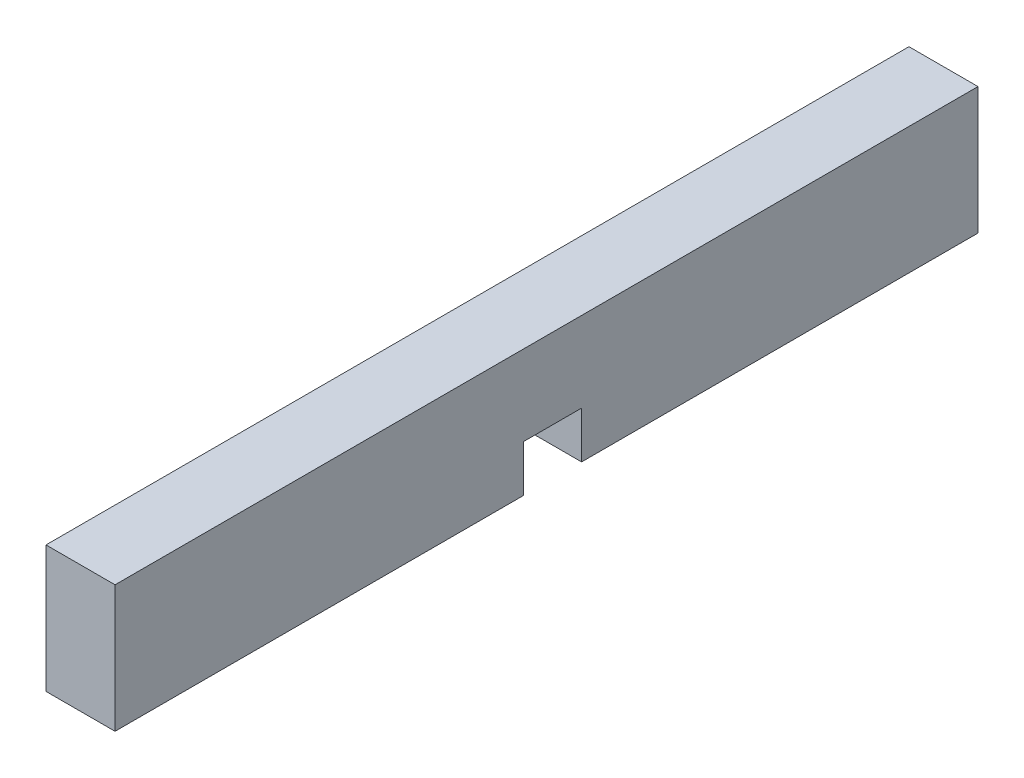
ISO-10303-21;
HEADER;
FILE_DESCRIPTION(('STEP AP214'),'2;1');
FILE_NAME('part.step','',(''),(''),'','','');
FILE_SCHEMA(('AUTOMOTIVE_DESIGN { 1 0 10303 214 1 1 1 1 }'));
ENDSEC;
DATA;
#1=APPLICATION_CONTEXT('core data for automotive mechanical design processes');
#2=APPLICATION_PROTOCOL_DEFINITION('international standard','automotive_design',2000,#1);
#3=PRODUCT_CONTEXT('',#1,'mechanical');
#4=PRODUCT('Part','Part','',(#3));
#5=PRODUCT_RELATED_PRODUCT_CATEGORY('part','',(#4));
#6=PRODUCT_DEFINITION_FORMATION('','',#4);
#7=PRODUCT_DEFINITION_CONTEXT('part definition',#1,'design');
#8=PRODUCT_DEFINITION('design','',#6,#7);
#9=PRODUCT_DEFINITION_SHAPE('','',#8);
#10=(LENGTH_UNIT() NAMED_UNIT(*) SI_UNIT(.MILLI.,.METRE.));
#11=(NAMED_UNIT(*) PLANE_ANGLE_UNIT() SI_UNIT($,.RADIAN.));
#12=(NAMED_UNIT(*) SI_UNIT($,.STERADIAN.) SOLID_ANGLE_UNIT());
#13=UNCERTAINTY_MEASURE_WITH_UNIT(LENGTH_MEASURE(1.E-05),#10,'distance_accuracy_value','');
#14=(GEOMETRIC_REPRESENTATION_CONTEXT(3) GLOBAL_UNCERTAINTY_ASSIGNED_CONTEXT((#13)) GLOBAL_UNIT_ASSIGNED_CONTEXT((#10,
#11,#12)) REPRESENTATION_CONTEXT('',''));
#15=CARTESIAN_POINT('',(0.,0.,0.));
#16=DIRECTION('',(0.,0.,1.));
#17=DIRECTION('',(1.,0.,0.));
#18=AXIS2_PLACEMENT_3D('',#15,#16,#17);
#19=CARTESIAN_POINT('',(2.3495,-4.318,29.3624));
#20=DIRECTION('',(0.,1.,0.));
#21=DIRECTION('',(0.,0.,1.));
#22=AXIS2_PLACEMENT_3D('',#19,#20,#21);
#23=PLANE('',#22);
#24=DIRECTION('',(0.,0.,-1.));
#25=VECTOR('',#24,1.);
#26=CARTESIAN_POINT('',(-2.3495,-4.318,29.3624));
#27=LINE('',#26,#25);
#28=CARTESIAN_POINT('',(-2.3495,-4.318,29.3624));
#29=VERTEX_POINT('',#28);
#30=CARTESIAN_POINT('',(-2.3495,-4.318,1.57480000000003));
#31=VERTEX_POINT('',#30);
#32=EDGE_CURVE('E132',#29,#31,#27,.T.);
#33=ORIENTED_EDGE('',*,*,#32,.T.);
#34=DIRECTION('',(1.,0.,0.));
#35=VECTOR('',#34,1.);
#36=CARTESIAN_POINT('',(-2.3495,-4.318,1.57480000000003));
#37=LINE('',#36,#35);
#38=CARTESIAN_POINT('',(2.3495,-4.318,1.57480000000003));
#39=VERTEX_POINT('',#38);
#40=EDGE_CURVE('E115',#31,#39,#37,.T.);
#41=ORIENTED_EDGE('',*,*,#40,.T.);
#42=DIRECTION('',(0.,0.,-1.));
#43=VECTOR('',#42,1.);
#44=CARTESIAN_POINT('',(2.3495,-4.318,29.3624));
#45=LINE('',#44,#43);
#46=CARTESIAN_POINT('',(2.3495,-4.318,29.3624));
#47=VERTEX_POINT('',#46);
#48=EDGE_CURVE('E148',#47,#39,#45,.T.);
#49=ORIENTED_EDGE('',*,*,#48,.F.);
#50=DIRECTION('',(-1.,0.,0.));
#51=VECTOR('',#50,1.);
#52=CARTESIAN_POINT('',(2.3495,-4.318,29.3624));
#53=LINE('',#52,#51);
#54=EDGE_CURVE('E138',#47,#29,#53,.T.);
#55=ORIENTED_EDGE('',*,*,#54,.T.);
#56=EDGE_LOOP('',(#33,#41,#49,#55));
#57=FACE_BOUND('',#56,.T.);
#58=ADVANCED_FACE('F39',(#57),#23,.F.);
#59=CARTESIAN_POINT('',(2.3495,4.318,-29.3624));
#60=DIRECTION('',(0.,0.,1.));
#61=DIRECTION('',(0.,-1.,0.));
#62=AXIS2_PLACEMENT_3D('',#59,#60,#61);
#63=PLANE('',#62);
#64=DIRECTION('',(0.,1.,0.));
#65=VECTOR('',#64,1.);
#66=CARTESIAN_POINT('',(-2.3495,4.318,-29.3624));
#67=LINE('',#66,#65);
#68=CARTESIAN_POINT('',(-2.3495,-4.318,-29.3624));
#69=VERTEX_POINT('',#68);
#70=CARTESIAN_POINT('',(-2.3495,4.318,-29.3624));
#71=VERTEX_POINT('',#70);
#72=EDGE_CURVE('E156',#69,#71,#67,.T.);
#73=ORIENTED_EDGE('',*,*,#72,.T.);
#74=DIRECTION('',(-1.,0.,0.));
#75=VECTOR('',#74,1.);
#76=CARTESIAN_POINT('',(2.3495,4.318,-29.3624));
#77=LINE('',#76,#75);
#78=CARTESIAN_POINT('',(2.3495,4.318,-29.3624));
#79=VERTEX_POINT('',#78);
#80=EDGE_CURVE('E11',#79,#71,#77,.T.);
#81=ORIENTED_EDGE('',*,*,#80,.F.);
#82=DIRECTION('',(0.,1.,0.));
#83=VECTOR('',#82,1.);
#84=CARTESIAN_POINT('',(2.3495,4.318,-29.3624));
#85=LINE('',#84,#83);
#86=CARTESIAN_POINT('',(2.3495,-4.318,-29.3624));
#87=VERTEX_POINT('',#86);
#88=EDGE_CURVE('E139',#87,#79,#85,.T.);
#89=ORIENTED_EDGE('',*,*,#88,.F.);
#90=DIRECTION('',(-1.,0.,0.));
#91=VECTOR('',#90,1.);
#92=CARTESIAN_POINT('',(2.3495,-4.318,-29.3624));
#93=LINE('',#92,#91);
#94=EDGE_CURVE('E146',#87,#69,#93,.T.);
#95=ORIENTED_EDGE('',*,*,#94,.T.);
#96=EDGE_LOOP('',(#73,#81,#89,#95));
#97=FACE_BOUND('',#96,.T.);
#98=ADVANCED_FACE('F41',(#97),#63,.F.);
#99=CARTESIAN_POINT('',(2.3495,4.318,29.3624));
#100=DIRECTION('',(0.,-1.,0.));
#101=DIRECTION('',(0.,0.,-1.));
#102=AXIS2_PLACEMENT_3D('',#99,#100,#101);
#103=PLANE('',#102);
#104=DIRECTION('',(0.,0.,1.));
#105=VECTOR('',#104,1.);
#106=CARTESIAN_POINT('',(-2.3495,4.318,29.3624));
#107=LINE('',#106,#105);
#108=CARTESIAN_POINT('',(-2.3495,4.318,29.3624));
#109=VERTEX_POINT('',#108);
#110=EDGE_CURVE('E155',#71,#109,#107,.T.);
#111=ORIENTED_EDGE('',*,*,#110,.T.);
#112=DIRECTION('',(-1.,0.,0.));
#113=VECTOR('',#112,1.);
#114=CARTESIAN_POINT('',(2.3495,4.318,29.3624));
#115=LINE('',#114,#113);
#116=CARTESIAN_POINT('',(2.3495,4.318,29.3624));
#117=VERTEX_POINT('',#116);
#118=EDGE_CURVE('E47',#117,#109,#115,.T.);
#119=ORIENTED_EDGE('',*,*,#118,.F.);
#120=DIRECTION('',(0.,0.,1.));
#121=VECTOR('',#120,1.);
#122=CARTESIAN_POINT('',(2.3495,4.318,29.3624));
#123=LINE('',#122,#121);
#124=EDGE_CURVE('E92',#79,#117,#123,.T.);
#125=ORIENTED_EDGE('',*,*,#124,.F.);
#126=ORIENTED_EDGE('',*,*,#80,.T.);
#127=EDGE_LOOP('',(#111,#119,#125,#126));
#128=FACE_BOUND('',#127,.T.);
#129=ADVANCED_FACE('F198',(#128),#103,.F.);
#130=CARTESIAN_POINT('',(2.3495,4.318,29.3624));
#131=DIRECTION('',(0.,0.,-1.));
#132=DIRECTION('',(0.,1.,0.));
#133=AXIS2_PLACEMENT_3D('',#130,#131,#132);
#134=PLANE('',#133);
#135=DIRECTION('',(0.,-1.,0.));
#136=VECTOR('',#135,1.);
#137=CARTESIAN_POINT('',(-2.3495,4.318,29.3624));
#138=LINE('',#137,#136);
#139=EDGE_CURVE('E142',#109,#29,#138,.T.);
#140=ORIENTED_EDGE('',*,*,#139,.T.);
#141=ORIENTED_EDGE('',*,*,#54,.F.);
#142=DIRECTION('',(0.,-1.,0.));
#143=VECTOR('',#142,1.);
#144=CARTESIAN_POINT('',(2.3495,4.318,29.3624));
#145=LINE('',#144,#143);
#146=EDGE_CURVE('E153',#117,#47,#145,.T.);
#147=ORIENTED_EDGE('',*,*,#146,.F.);
#148=ORIENTED_EDGE('',*,*,#118,.T.);
#149=EDGE_LOOP('',(#140,#141,#147,#148));
#150=FACE_BOUND('',#149,.T.);
#151=ADVANCED_FACE('F152',(#150),#134,.F.);
#152=CARTESIAN_POINT('',(2.3495,-4.318,-2.38759999999997));
#153=VERTEX_POINT('',#152);
#154=EDGE_CURVE('E63',#153,#87,#45,.T.);
#155=ORIENTED_EDGE('',*,*,#154,.F.);
#156=DIRECTION('',(1.,0.,0.));
#157=VECTOR('',#156,1.);
#158=CARTESIAN_POINT('',(-2.3495,-4.318,-2.38759999999997));
#159=LINE('',#158,#157);
#160=CARTESIAN_POINT('',(-2.3495,-4.318,-2.38759999999997));
#161=VERTEX_POINT('',#160);
#162=EDGE_CURVE('E126',#161,#153,#159,.T.);
#163=ORIENTED_EDGE('',*,*,#162,.F.);
#164=EDGE_CURVE('E85',#161,#69,#27,.T.);
#165=ORIENTED_EDGE('',*,*,#164,.T.);
#166=ORIENTED_EDGE('',*,*,#94,.F.);
#167=EDGE_LOOP('',(#155,#163,#165,#166));
#168=FACE_BOUND('',#167,.T.);
#169=ADVANCED_FACE('F176',(#168),#23,.F.);
#170=CARTESIAN_POINT('',(2.3495,0.,0.));
#171=DIRECTION('',(1.,0.,0.));
#172=DIRECTION('',(0.,0.,-1.));
#173=AXIS2_PLACEMENT_3D('',#170,#171,#172);
#174=PLANE('',#173);
#175=DIRECTION('',(0.,-1.,0.));
#176=VECTOR('',#175,1.);
#177=CARTESIAN_POINT('',(2.3495,0.,1.57480000000003));
#178=LINE('',#177,#176);
#179=CARTESIAN_POINT('',(2.3495,-1.143,1.57480000000003));
#180=VERTEX_POINT('',#179);
#181=EDGE_CURVE('E121',#180,#39,#178,.T.);
#182=ORIENTED_EDGE('',*,*,#181,.F.);
#183=DIRECTION('',(0.,0.,1.));
#184=VECTOR('',#183,1.);
#185=CARTESIAN_POINT('',(2.3495,-1.143,0.));
#186=LINE('',#185,#184);
#187=CARTESIAN_POINT('',(2.3495,-1.143,-2.38759999999997));
#188=VERTEX_POINT('',#187);
#189=EDGE_CURVE('E164',#188,#180,#186,.T.);
#190=ORIENTED_EDGE('',*,*,#189,.F.);
#191=DIRECTION('',(0.,1.,0.));
#192=VECTOR('',#191,1.);
#193=CARTESIAN_POINT('',(2.3495,0.,-2.38759999999997));
#194=LINE('',#193,#192);
#195=EDGE_CURVE('E166',#153,#188,#194,.T.);
#196=ORIENTED_EDGE('',*,*,#195,.F.);
#197=ORIENTED_EDGE('',*,*,#154,.T.);
#198=ORIENTED_EDGE('',*,*,#88,.T.);
#199=ORIENTED_EDGE('',*,*,#124,.T.);
#200=ORIENTED_EDGE('',*,*,#146,.T.);
#201=ORIENTED_EDGE('',*,*,#48,.T.);
#202=EDGE_LOOP('',(#182,#190,#196,#197,#198,#199,#200,#201));
#203=FACE_BOUND('',#202,.T.);
#204=ADVANCED_FACE('F180',(#203),#174,.T.);
#205=CARTESIAN_POINT('',(-2.3495,0.,0.));
#206=DIRECTION('',(1.,0.,0.));
#207=DIRECTION('',(0.,0.,-1.));
#208=AXIS2_PLACEMENT_3D('',#205,#206,#207);
#209=PLANE('',#208);
#210=DIRECTION('',(0.,0.,1.));
#211=VECTOR('',#210,1.);
#212=CARTESIAN_POINT('',(-2.3495,-1.143,1.57480000000003));
#213=LINE('',#212,#211);
#214=CARTESIAN_POINT('',(-2.3495,-1.143,-2.38759999999997));
#215=VERTEX_POINT('',#214);
#216=CARTESIAN_POINT('',(-2.3495,-1.143,1.57480000000003));
#217=VERTEX_POINT('',#216);
#218=EDGE_CURVE('E54',#215,#217,#213,.T.);
#219=ORIENTED_EDGE('',*,*,#218,.T.);
#220=DIRECTION('',(0.,-1.,0.));
#221=VECTOR('',#220,1.);
#222=CARTESIAN_POINT('',(-2.3495,-4.318,1.57480000000003));
#223=LINE('',#222,#221);
#224=EDGE_CURVE('E119',#217,#31,#223,.T.);
#225=ORIENTED_EDGE('',*,*,#224,.T.);
#226=ORIENTED_EDGE('',*,*,#32,.F.);
#227=ORIENTED_EDGE('',*,*,#139,.F.);
#228=ORIENTED_EDGE('',*,*,#110,.F.);
#229=ORIENTED_EDGE('',*,*,#72,.F.);
#230=ORIENTED_EDGE('',*,*,#164,.F.);
#231=DIRECTION('',(0.,1.,0.));
#232=VECTOR('',#231,1.);
#233=CARTESIAN_POINT('',(-2.3495,-4.318,-2.38759999999997));
#234=LINE('',#233,#232);
#235=EDGE_CURVE('E134',#161,#215,#234,.T.);
#236=ORIENTED_EDGE('',*,*,#235,.T.);
#237=EDGE_LOOP('',(#219,#225,#226,#227,#228,#229,#230,#236));
#238=FACE_BOUND('',#237,.T.);
#239=ADVANCED_FACE('F130',(#238),#209,.F.);
#240=CARTESIAN_POINT('',(-2.3495,-4.318,1.57480000000003));
#241=DIRECTION('',(0.,0.,1.));
#242=DIRECTION('',(1.,0.,0.));
#243=AXIS2_PLACEMENT_3D('',#240,#241,#242);
#244=PLANE('',#243);
#245=ORIENTED_EDGE('',*,*,#181,.T.);
#246=ORIENTED_EDGE('',*,*,#40,.F.);
#247=ORIENTED_EDGE('',*,*,#224,.F.);
#248=DIRECTION('',(1.,0.,0.));
#249=VECTOR('',#248,1.);
#250=CARTESIAN_POINT('',(-2.3495,-1.143,1.57480000000003));
#251=LINE('',#250,#249);
#252=EDGE_CURVE('E167',#217,#180,#251,.T.);
#253=ORIENTED_EDGE('',*,*,#252,.T.);
#254=EDGE_LOOP('',(#245,#246,#247,#253));
#255=FACE_BOUND('',#254,.T.);
#256=ADVANCED_FACE('F117',(#255),#244,.F.);
#257=CARTESIAN_POINT('',(-2.3495,-1.143,1.57480000000003));
#258=DIRECTION('',(0.,1.,0.));
#259=DIRECTION('',(0.,0.,1.));
#260=AXIS2_PLACEMENT_3D('',#257,#258,#259);
#261=PLANE('',#260);
#262=ORIENTED_EDGE('',*,*,#189,.T.);
#263=ORIENTED_EDGE('',*,*,#252,.F.);
#264=ORIENTED_EDGE('',*,*,#218,.F.);
#265=DIRECTION('',(1.,0.,0.));
#266=VECTOR('',#265,1.);
#267=CARTESIAN_POINT('',(-2.3495,-1.143,-2.38759999999997));
#268=LINE('',#267,#266);
#269=EDGE_CURVE('E170',#215,#188,#268,.T.);
#270=ORIENTED_EDGE('',*,*,#269,.T.);
#271=EDGE_LOOP('',(#262,#263,#264,#270));
#272=FACE_BOUND('',#271,.T.);
#273=ADVANCED_FACE('F182',(#272),#261,.F.);
#274=CARTESIAN_POINT('',(-2.3495,-4.318,-2.38759999999997));
#275=DIRECTION('',(0.,0.,-1.));
#276=DIRECTION('',(-1.,0.,0.));
#277=AXIS2_PLACEMENT_3D('',#274,#275,#276);
#278=PLANE('',#277);
#279=ORIENTED_EDGE('',*,*,#195,.T.);
#280=ORIENTED_EDGE('',*,*,#269,.F.);
#281=ORIENTED_EDGE('',*,*,#235,.F.);
#282=ORIENTED_EDGE('',*,*,#162,.T.);
#283=EDGE_LOOP('',(#279,#280,#281,#282));
#284=FACE_BOUND('',#283,.T.);
#285=ADVANCED_FACE('F175',(#284),#278,.F.);
#286=CLOSED_SHELL('',(#58,#98,#129,#151,#169,#204,#239,#256,#273,#285));
#287=MANIFOLD_SOLID_BREP('B2',#286);
#288=ADVANCED_BREP_SHAPE_REPRESENTATION('',(#18,#287),#14);
#289=SHAPE_DEFINITION_REPRESENTATION(#9,#288);
ENDSEC;
END-ISO-10303-21;
